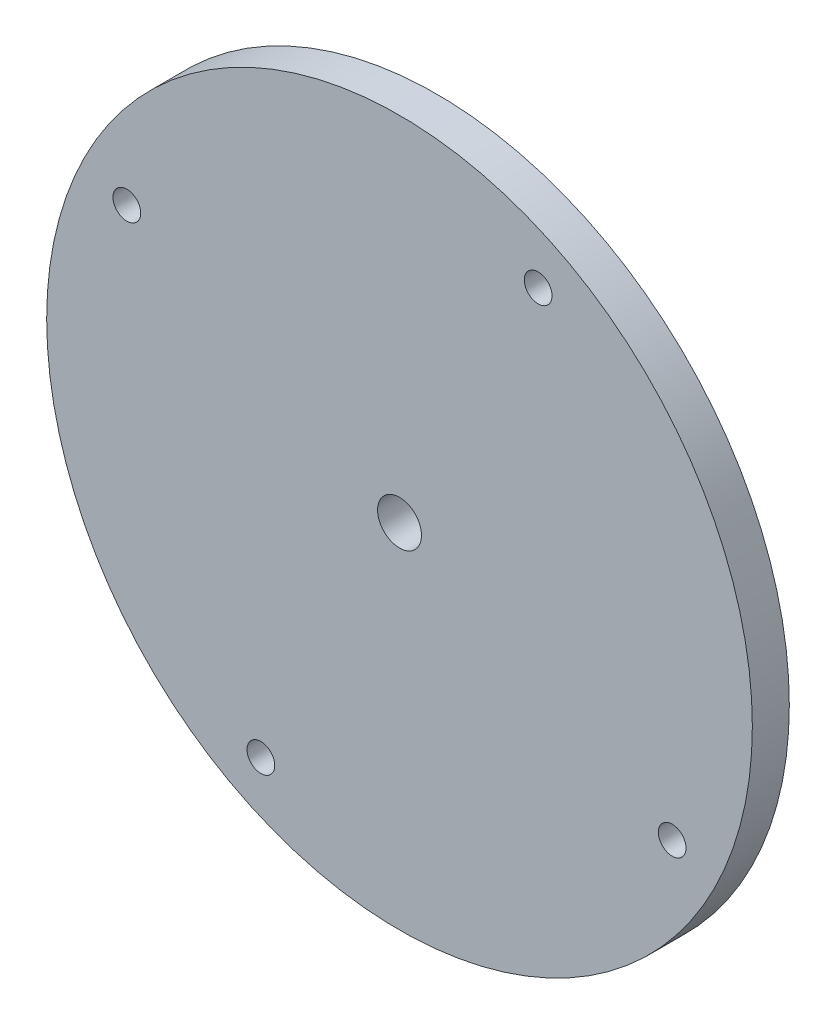
ISO-10303-21;
HEADER;
FILE_DESCRIPTION(('STEP AP214'),'2;1');
FILE_NAME('part.step','',(''),(''),'','','');
FILE_SCHEMA(('AUTOMOTIVE_DESIGN { 1 0 10303 214 1 1 1 1 }'));
ENDSEC;
DATA;
#1=APPLICATION_CONTEXT('core data for automotive mechanical design processes');
#2=APPLICATION_PROTOCOL_DEFINITION('international standard','automotive_design',2000,#1);
#3=PRODUCT_CONTEXT('',#1,'mechanical');
#4=PRODUCT('Part','Part','',(#3));
#5=PRODUCT_RELATED_PRODUCT_CATEGORY('part','',(#4));
#6=PRODUCT_DEFINITION_FORMATION('','',#4);
#7=PRODUCT_DEFINITION_CONTEXT('part definition',#1,'design');
#8=PRODUCT_DEFINITION('design','',#6,#7);
#9=PRODUCT_DEFINITION_SHAPE('','',#8);
#10=(LENGTH_UNIT() NAMED_UNIT(*) SI_UNIT(.MILLI.,.METRE.));
#11=(NAMED_UNIT(*) PLANE_ANGLE_UNIT() SI_UNIT($,.RADIAN.));
#12=(NAMED_UNIT(*) SI_UNIT($,.STERADIAN.) SOLID_ANGLE_UNIT());
#13=UNCERTAINTY_MEASURE_WITH_UNIT(LENGTH_MEASURE(1.E-05),#10,'distance_accuracy_value','');
#14=(GEOMETRIC_REPRESENTATION_CONTEXT(3) GLOBAL_UNCERTAINTY_ASSIGNED_CONTEXT((#13)) GLOBAL_UNIT_ASSIGNED_CONTEXT((#10,
#11,#12)) REPRESENTATION_CONTEXT('',''));
#15=CARTESIAN_POINT('',(0.,0.,0.));
#16=DIRECTION('',(0.,0.,1.));
#17=DIRECTION('',(1.,0.,0.));
#18=AXIS2_PLACEMENT_3D('',#15,#16,#17);
#19=CARTESIAN_POINT('',(-58.9999999999992,29.9999999999995,8.));
#20=DIRECTION('',(0.,0.,-1.));
#21=DIRECTION('',(-1.,0.,0.));
#22=AXIS2_PLACEMENT_3D('',#19,#20,#21);
#23=CYLINDRICAL_SURFACE('',#22,3.);
#24=CARTESIAN_POINT('',(-58.9999999999992,29.9999999999995,8.));
#25=DIRECTION('',(0.,0.,1.));
#26=DIRECTION('',(1.,0.,0.));
#27=AXIS2_PLACEMENT_3D('',#24,#25,#26);
#28=CIRCLE('',#27,3.);
#29=CARTESIAN_POINT('',(-55.9999999999992,29.9999999999995,8.));
#30=VERTEX_POINT('',#29);
#31=EDGE_CURVE('E45',#30,#30,#28,.T.);
#32=ORIENTED_EDGE('',*,*,#31,.T.);
#33=EDGE_LOOP('',(#32));
#34=FACE_BOUND('',#33,.T.);
#35=CARTESIAN_POINT('',(-58.9999999999992,29.9999999999995,0.));
#36=DIRECTION('',(0.,0.,1.));
#37=DIRECTION('',(1.,0.,0.));
#38=AXIS2_PLACEMENT_3D('',#35,#36,#37);
#39=CIRCLE('',#38,3.);
#40=CARTESIAN_POINT('',(-55.9999999999992,29.9999999999995,0.));
#41=VERTEX_POINT('',#40);
#42=EDGE_CURVE('E63',#41,#41,#39,.T.);
#43=ORIENTED_EDGE('',*,*,#42,.F.);
#44=EDGE_LOOP('',(#43));
#45=FACE_BOUND('',#44,.T.);
#46=ADVANCED_FACE('F37',(#34,#45),#23,.F.);
#47=CARTESIAN_POINT('',(59.,-30.0000000000005,8.));
#48=DIRECTION('',(0.,0.,-1.));
#49=DIRECTION('',(-1.,0.,0.));
#50=AXIS2_PLACEMENT_3D('',#47,#48,#49);
#51=CYLINDRICAL_SURFACE('',#50,3.00000000000001);
#52=CARTESIAN_POINT('',(59.,-30.0000000000005,8.));
#53=DIRECTION('',(0.,0.,1.));
#54=DIRECTION('',(1.,0.,0.));
#55=AXIS2_PLACEMENT_3D('',#52,#53,#54);
#56=CIRCLE('',#55,3.00000000000001);
#57=CARTESIAN_POINT('',(62.,-30.0000000000005,8.));
#58=VERTEX_POINT('',#57);
#59=EDGE_CURVE('E50',#58,#58,#56,.T.);
#60=ORIENTED_EDGE('',*,*,#59,.T.);
#61=EDGE_LOOP('',(#60));
#62=FACE_BOUND('',#61,.T.);
#63=CARTESIAN_POINT('',(59.,-30.0000000000005,0.));
#64=DIRECTION('',(0.,0.,1.));
#65=DIRECTION('',(1.,0.,0.));
#66=AXIS2_PLACEMENT_3D('',#63,#64,#65);
#67=CIRCLE('',#66,3.00000000000001);
#68=CARTESIAN_POINT('',(62.,-30.0000000000005,0.));
#69=VERTEX_POINT('',#68);
#70=EDGE_CURVE('E61',#69,#69,#67,.T.);
#71=ORIENTED_EDGE('',*,*,#70,.F.);
#72=EDGE_LOOP('',(#71));
#73=FACE_BOUND('',#72,.T.);
#74=ADVANCED_FACE('F84',(#62,#73),#51,.F.);
#75=CARTESIAN_POINT('',(-29.9999999999992,-59.,8.));
#76=DIRECTION('',(0.,0.,-1.));
#77=DIRECTION('',(-1.,0.,0.));
#78=AXIS2_PLACEMENT_3D('',#75,#76,#77);
#79=CYLINDRICAL_SURFACE('',#78,3.);
#80=CARTESIAN_POINT('',(-29.9999999999992,-59.,8.));
#81=DIRECTION('',(0.,0.,1.));
#82=DIRECTION('',(1.,0.,0.));
#83=AXIS2_PLACEMENT_3D('',#80,#81,#82);
#84=CIRCLE('',#83,3.);
#85=CARTESIAN_POINT('',(-26.9999999999992,-59.,8.));
#86=VERTEX_POINT('',#85);
#87=EDGE_CURVE('E72',#86,#86,#84,.T.);
#88=ORIENTED_EDGE('',*,*,#87,.T.);
#89=EDGE_LOOP('',(#88));
#90=FACE_BOUND('',#89,.T.);
#91=CARTESIAN_POINT('',(-29.9999999999992,-59.,0.));
#92=DIRECTION('',(0.,0.,1.));
#93=DIRECTION('',(1.,0.,0.));
#94=AXIS2_PLACEMENT_3D('',#91,#92,#93);
#95=CIRCLE('',#94,3.);
#96=CARTESIAN_POINT('',(-26.9999999999992,-59.,0.));
#97=VERTEX_POINT('',#96);
#98=EDGE_CURVE('E57',#97,#97,#95,.T.);
#99=ORIENTED_EDGE('',*,*,#98,.F.);
#100=EDGE_LOOP('',(#99));
#101=FACE_BOUND('',#100,.T.);
#102=ADVANCED_FACE('F103',(#90,#101),#79,.F.);
#103=CARTESIAN_POINT('',(0.,0.,8.));
#104=DIRECTION('',(0.,0.,-1.));
#105=DIRECTION('',(-1.,0.,0.));
#106=AXIS2_PLACEMENT_3D('',#103,#104,#105);
#107=CYLINDRICAL_SURFACE('',#106,76.35);
#108=CARTESIAN_POINT('',(0.,0.,8.));
#109=DIRECTION('',(0.,0.,1.));
#110=DIRECTION('',(1.,0.,0.));
#111=AXIS2_PLACEMENT_3D('',#108,#109,#110);
#112=CIRCLE('',#111,76.35);
#113=CARTESIAN_POINT('',(76.35,0.,8.));
#114=VERTEX_POINT('',#113);
#115=EDGE_CURVE('E68',#114,#114,#112,.T.);
#116=ORIENTED_EDGE('',*,*,#115,.F.);
#117=EDGE_LOOP('',(#116));
#118=FACE_BOUND('',#117,.T.);
#119=CARTESIAN_POINT('',(0.,0.,0.));
#120=DIRECTION('',(0.,0.,1.));
#121=DIRECTION('',(1.,0.,0.));
#122=AXIS2_PLACEMENT_3D('',#119,#120,#121);
#123=CIRCLE('',#122,76.35);
#124=CARTESIAN_POINT('',(76.35,0.,0.));
#125=VERTEX_POINT('',#124);
#126=EDGE_CURVE('E54',#125,#125,#123,.T.);
#127=ORIENTED_EDGE('',*,*,#126,.T.);
#128=EDGE_LOOP('',(#127));
#129=FACE_BOUND('',#128,.T.);
#130=ADVANCED_FACE('F39',(#118,#129),#107,.T.);
#131=CARTESIAN_POINT('',(30.0000000000008,59.,8.));
#132=DIRECTION('',(0.,0.,-1.));
#133=DIRECTION('',(-1.,0.,0.));
#134=AXIS2_PLACEMENT_3D('',#131,#132,#133);
#135=CYLINDRICAL_SURFACE('',#134,3.);
#136=CARTESIAN_POINT('',(30.0000000000008,59.,8.));
#137=DIRECTION('',(0.,0.,1.));
#138=DIRECTION('',(1.,0.,0.));
#139=AXIS2_PLACEMENT_3D('',#136,#137,#138);
#140=CIRCLE('',#139,3.);
#141=CARTESIAN_POINT('',(33.0000000000008,59.,8.));
#142=VERTEX_POINT('',#141);
#143=EDGE_CURVE('E10',#142,#142,#140,.T.);
#144=ORIENTED_EDGE('',*,*,#143,.T.);
#145=EDGE_LOOP('',(#144));
#146=FACE_BOUND('',#145,.T.);
#147=CARTESIAN_POINT('',(30.0000000000008,59.,0.));
#148=DIRECTION('',(0.,0.,1.));
#149=DIRECTION('',(1.,0.,0.));
#150=AXIS2_PLACEMENT_3D('',#147,#148,#149);
#151=CIRCLE('',#150,3.);
#152=CARTESIAN_POINT('',(33.0000000000008,59.,0.));
#153=VERTEX_POINT('',#152);
#154=EDGE_CURVE('E41',#153,#153,#151,.T.);
#155=ORIENTED_EDGE('',*,*,#154,.F.);
#156=EDGE_LOOP('',(#155));
#157=FACE_BOUND('',#156,.T.);
#158=ADVANCED_FACE('F91',(#146,#157),#135,.F.);
#159=CARTESIAN_POINT('',(0.,0.,8.));
#160=DIRECTION('',(0.,0.,1.));
#161=DIRECTION('',(1.,0.,0.));
#162=AXIS2_PLACEMENT_3D('',#159,#160,#161);
#163=PLANE('',#162);
#164=CARTESIAN_POINT('',(0.,0.,8.));
#165=DIRECTION('',(0.,0.,1.));
#166=DIRECTION('',(1.,0.,0.));
#167=AXIS2_PLACEMENT_3D('',#164,#165,#166);
#168=CIRCLE('',#167,4.75);
#169=CARTESIAN_POINT('',(4.75,0.,8.));
#170=VERTEX_POINT('',#169);
#171=EDGE_CURVE('E79',#170,#170,#168,.T.);
#172=ORIENTED_EDGE('',*,*,#171,.F.);
#173=EDGE_LOOP('',(#172));
#174=FACE_BOUND('',#173,.T.);
#175=ORIENTED_EDGE('',*,*,#115,.T.);
#176=EDGE_LOOP('',(#175));
#177=FACE_BOUND('',#176,.T.);
#178=ORIENTED_EDGE('',*,*,#87,.F.);
#179=EDGE_LOOP('',(#178));
#180=FACE_BOUND('',#179,.T.);
#181=ORIENTED_EDGE('',*,*,#59,.F.);
#182=EDGE_LOOP('',(#181));
#183=FACE_BOUND('',#182,.T.);
#184=ORIENTED_EDGE('',*,*,#31,.F.);
#185=EDGE_LOOP('',(#184));
#186=FACE_BOUND('',#185,.T.);
#187=ORIENTED_EDGE('',*,*,#143,.F.);
#188=EDGE_LOOP('',(#187));
#189=FACE_BOUND('',#188,.T.);
#190=ADVANCED_FACE('F87',(#174,#177,#180,#183,#186,#189),#163,.T.);
#191=CARTESIAN_POINT('',(0.,0.,0.));
#192=DIRECTION('',(0.,0.,1.));
#193=DIRECTION('',(1.,0.,0.));
#194=AXIS2_PLACEMENT_3D('',#191,#192,#193);
#195=PLANE('',#194);
#196=CARTESIAN_POINT('',(0.,0.,0.));
#197=DIRECTION('',(0.,0.,1.));
#198=DIRECTION('',(1.,0.,0.));
#199=AXIS2_PLACEMENT_3D('',#196,#197,#198);
#200=CIRCLE('',#199,4.75);
#201=CARTESIAN_POINT('',(4.75,0.,0.));
#202=VERTEX_POINT('',#201);
#203=EDGE_CURVE('E58',#202,#202,#200,.T.);
#204=ORIENTED_EDGE('',*,*,#203,.T.);
#205=EDGE_LOOP('',(#204));
#206=FACE_BOUND('',#205,.T.);
#207=ORIENTED_EDGE('',*,*,#126,.F.);
#208=EDGE_LOOP('',(#207));
#209=FACE_BOUND('',#208,.T.);
#210=ORIENTED_EDGE('',*,*,#98,.T.);
#211=EDGE_LOOP('',(#210));
#212=FACE_BOUND('',#211,.T.);
#213=ORIENTED_EDGE('',*,*,#70,.T.);
#214=EDGE_LOOP('',(#213));
#215=FACE_BOUND('',#214,.T.);
#216=ORIENTED_EDGE('',*,*,#42,.T.);
#217=EDGE_LOOP('',(#216));
#218=FACE_BOUND('',#217,.T.);
#219=ORIENTED_EDGE('',*,*,#154,.T.);
#220=EDGE_LOOP('',(#219));
#221=FACE_BOUND('',#220,.T.);
#222=ADVANCED_FACE('F90',(#206,#209,#212,#215,#218,#221),#195,.F.);
#223=CARTESIAN_POINT('',(0.,0.,0.));
#224=DIRECTION('',(0.,0.,1.));
#225=DIRECTION('',(1.,0.,0.));
#226=AXIS2_PLACEMENT_3D('',#223,#224,#225);
#227=CYLINDRICAL_SURFACE('',#226,4.75);
#228=ORIENTED_EDGE('',*,*,#203,.F.);
#229=EDGE_LOOP('',(#228));
#230=FACE_BOUND('',#229,.T.);
#231=ORIENTED_EDGE('',*,*,#171,.T.);
#232=EDGE_LOOP('',(#231));
#233=FACE_BOUND('',#232,.T.);
#234=ADVANCED_FACE('F119',(#230,#233),#227,.F.);
#235=CLOSED_SHELL('',(#46,#74,#102,#130,#158,#190,#222,#234));
#236=MANIFOLD_SOLID_BREP('B2',#235);
#237=ADVANCED_BREP_SHAPE_REPRESENTATION('',(#18,#236),#14);
#238=SHAPE_DEFINITION_REPRESENTATION(#9,#237);
ENDSEC;
END-ISO-10303-21;
